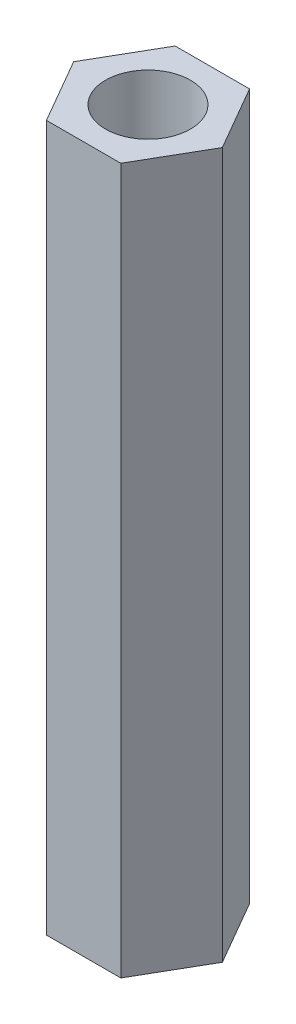
ISO-10303-21;
HEADER;
FILE_DESCRIPTION(('STEP AP214'),'2;1');
FILE_NAME('part.step','',(''),(''),'','','');
FILE_SCHEMA(('AUTOMOTIVE_DESIGN { 1 0 10303 214 1 1 1 1 }'));
ENDSEC;
DATA;
#1=APPLICATION_CONTEXT('core data for automotive mechanical design processes');
#2=APPLICATION_PROTOCOL_DEFINITION('international standard','automotive_design',2000,#1);
#3=PRODUCT_CONTEXT('',#1,'mechanical');
#4=PRODUCT('Part','Part','',(#3));
#5=PRODUCT_RELATED_PRODUCT_CATEGORY('part','',(#4));
#6=PRODUCT_DEFINITION_FORMATION('','',#4);
#7=PRODUCT_DEFINITION_CONTEXT('part definition',#1,'design');
#8=PRODUCT_DEFINITION('design','',#6,#7);
#9=PRODUCT_DEFINITION_SHAPE('','',#8);
#10=(LENGTH_UNIT() NAMED_UNIT(*) SI_UNIT(.MILLI.,.METRE.));
#11=(NAMED_UNIT(*) PLANE_ANGLE_UNIT() SI_UNIT($,.RADIAN.));
#12=(NAMED_UNIT(*) SI_UNIT($,.STERADIAN.) SOLID_ANGLE_UNIT());
#13=UNCERTAINTY_MEASURE_WITH_UNIT(LENGTH_MEASURE(1.E-05),#10,'distance_accuracy_value','');
#14=(GEOMETRIC_REPRESENTATION_CONTEXT(3) GLOBAL_UNCERTAINTY_ASSIGNED_CONTEXT((#13)) GLOBAL_UNIT_ASSIGNED_CONTEXT((#10,
#11,#12)) REPRESENTATION_CONTEXT('',''));
#15=CARTESIAN_POINT('',(0.,0.,0.));
#16=DIRECTION('',(0.,0.,1.));
#17=DIRECTION('',(1.,0.,0.));
#18=AXIS2_PLACEMENT_3D('',#15,#16,#17);
#19=CARTESIAN_POINT('',(0.,32.,0.));
#20=DIRECTION('',(0.,1.,0.));
#21=DIRECTION('',(0.,0.,1.));
#22=AXIS2_PLACEMENT_3D('',#19,#20,#21);
#23=PLANE('',#22);
#24=DIRECTION('',(-0.499999999999995,0.,0.866025403784442));
#25=VECTOR('',#24,1.);
#26=CARTESIAN_POINT('',(-1.68586278603374,32.,-2.91999999999998));
#27=LINE('',#26,#25);
#28=CARTESIAN_POINT('',(-1.68586278603374,32.,-2.91999999999998));
#29=VERTEX_POINT('',#28);
#30=CARTESIAN_POINT('',(-3.37172557206741,32.,0.));
#31=VERTEX_POINT('',#30);
#32=EDGE_CURVE('E130',#29,#31,#27,.T.);
#33=ORIENTED_EDGE('',*,*,#32,.T.);
#34=DIRECTION('',(0.500000000000001,0.,0.866025403784438));
#35=VECTOR('',#34,1.);
#36=CARTESIAN_POINT('',(-3.37172557206741,32.,0.));
#37=LINE('',#36,#35);
#38=CARTESIAN_POINT('',(-1.6858627860337,32.,2.92));
#39=VERTEX_POINT('',#38);
#40=EDGE_CURVE('E88',#31,#39,#37,.T.);
#41=ORIENTED_EDGE('',*,*,#40,.T.);
#42=DIRECTION('',(1.,0.,0.));
#43=VECTOR('',#42,1.);
#44=CARTESIAN_POINT('',(-1.6858627860337,32.,2.92));
#45=LINE('',#44,#43);
#46=CARTESIAN_POINT('',(1.68586278603372,32.,2.91999999999999));
#47=VERTEX_POINT('',#46);
#48=EDGE_CURVE('E101',#39,#47,#45,.T.);
#49=ORIENTED_EDGE('',*,*,#48,.T.);
#50=DIRECTION('',(0.499999999999995,0.,-0.866025403784441));
#51=VECTOR('',#50,1.);
#52=CARTESIAN_POINT('',(1.68586278603372,32.,2.91999999999999));
#53=LINE('',#52,#51);
#54=CARTESIAN_POINT('',(3.37172557206741,32.,0.));
#55=VERTEX_POINT('',#54);
#56=EDGE_CURVE('E95',#47,#55,#53,.T.);
#57=ORIENTED_EDGE('',*,*,#56,.T.);
#58=DIRECTION('',(-0.500000000000007,0.,-0.866025403784435));
#59=VECTOR('',#58,1.);
#60=CARTESIAN_POINT('',(3.37172557206741,32.,0.));
#61=LINE('',#60,#59);
#62=CARTESIAN_POINT('',(1.68586278603368,32.,-2.92000000000002));
#63=VERTEX_POINT('',#62);
#64=EDGE_CURVE('E99',#55,#63,#61,.T.);
#65=ORIENTED_EDGE('',*,*,#64,.T.);
#66=DIRECTION('',(-1.,0.,0.));
#67=VECTOR('',#66,1.);
#68=CARTESIAN_POINT('',(1.68586278603368,32.,-2.92000000000002));
#69=LINE('',#68,#67);
#70=EDGE_CURVE('E51',#63,#29,#69,.T.);
#71=ORIENTED_EDGE('',*,*,#70,.T.);
#72=EDGE_LOOP('',(#33,#41,#49,#57,#65,#71));
#73=FACE_BOUND('',#72,.T.);
#74=CARTESIAN_POINT('',(0.,32.,0.));
#75=DIRECTION('',(0.,1.,0.));
#76=DIRECTION('',(0.,0.,1.));
#77=AXIS2_PLACEMENT_3D('',#74,#75,#76);
#78=CIRCLE('',#77,1.925);
#79=CARTESIAN_POINT('',(0.,32.,1.925));
#80=VERTEX_POINT('',#79);
#81=EDGE_CURVE('E123',#80,#80,#78,.T.);
#82=ORIENTED_EDGE('',*,*,#81,.F.);
#83=EDGE_LOOP('',(#82));
#84=FACE_BOUND('',#83,.T.);
#85=ADVANCED_FACE('F34',(#73,#84),#23,.T.);
#86=CARTESIAN_POINT('',(0.,0.,0.));
#87=DIRECTION('',(0.,1.,0.));
#88=DIRECTION('',(0.,0.,1.));
#89=AXIS2_PLACEMENT_3D('',#86,#87,#88);
#90=PLANE('',#89);
#91=DIRECTION('',(-0.499999999999995,0.,0.866025403784442));
#92=VECTOR('',#91,1.);
#93=CARTESIAN_POINT('',(-1.68586278603374,0.,-2.91999999999998));
#94=LINE('',#93,#92);
#95=CARTESIAN_POINT('',(-1.68586278603374,0.,-2.91999999999998));
#96=VERTEX_POINT('',#95);
#97=CARTESIAN_POINT('',(-3.37172557206741,0.,0.));
#98=VERTEX_POINT('',#97);
#99=EDGE_CURVE('E119',#96,#98,#94,.T.);
#100=ORIENTED_EDGE('',*,*,#99,.F.);
#101=DIRECTION('',(-1.,0.,0.));
#102=VECTOR('',#101,1.);
#103=CARTESIAN_POINT('',(1.68586278603368,0.,-2.92000000000002));
#104=LINE('',#103,#102);
#105=CARTESIAN_POINT('',(1.68586278603368,0.,-2.92000000000002));
#106=VERTEX_POINT('',#105);
#107=EDGE_CURVE('E80',#106,#96,#104,.T.);
#108=ORIENTED_EDGE('',*,*,#107,.F.);
#109=DIRECTION('',(-0.500000000000007,0.,-0.866025403784435));
#110=VECTOR('',#109,1.);
#111=CARTESIAN_POINT('',(3.37172557206741,0.,0.));
#112=LINE('',#111,#110);
#113=CARTESIAN_POINT('',(3.37172557206741,0.,0.));
#114=VERTEX_POINT('',#113);
#115=EDGE_CURVE('E74',#114,#106,#112,.T.);
#116=ORIENTED_EDGE('',*,*,#115,.F.);
#117=DIRECTION('',(0.499999999999995,0.,-0.866025403784441));
#118=VECTOR('',#117,1.);
#119=CARTESIAN_POINT('',(1.68586278603372,0.,2.91999999999999));
#120=LINE('',#119,#118);
#121=CARTESIAN_POINT('',(1.68586278603372,0.,2.91999999999999));
#122=VERTEX_POINT('',#121);
#123=EDGE_CURVE('E109',#122,#114,#120,.T.);
#124=ORIENTED_EDGE('',*,*,#123,.F.);
#125=DIRECTION('',(1.,0.,0.));
#126=VECTOR('',#125,1.);
#127=CARTESIAN_POINT('',(-1.6858627860337,0.,2.92));
#128=LINE('',#127,#126);
#129=CARTESIAN_POINT('',(-1.6858627860337,0.,2.92));
#130=VERTEX_POINT('',#129);
#131=EDGE_CURVE('E125',#130,#122,#128,.T.);
#132=ORIENTED_EDGE('',*,*,#131,.F.);
#133=DIRECTION('',(0.500000000000001,0.,0.866025403784438));
#134=VECTOR('',#133,1.);
#135=CARTESIAN_POINT('',(-3.37172557206741,0.,0.));
#136=LINE('',#135,#134);
#137=EDGE_CURVE('E122',#98,#130,#136,.T.);
#138=ORIENTED_EDGE('',*,*,#137,.F.);
#139=EDGE_LOOP('',(#100,#108,#116,#124,#132,#138));
#140=FACE_BOUND('',#139,.T.);
#141=CARTESIAN_POINT('',(0.,0.,0.));
#142=DIRECTION('',(0.,1.,0.));
#143=DIRECTION('',(0.,0.,1.));
#144=AXIS2_PLACEMENT_3D('',#141,#142,#143);
#145=CIRCLE('',#144,1.925);
#146=CARTESIAN_POINT('',(0.,0.,1.925));
#147=VERTEX_POINT('',#146);
#148=EDGE_CURVE('E223',#147,#147,#145,.T.);
#149=ORIENTED_EDGE('',*,*,#148,.T.);
#150=EDGE_LOOP('',(#149));
#151=FACE_BOUND('',#150,.T.);
#152=ADVANCED_FACE('F139',(#140,#151),#90,.F.);
#153=CARTESIAN_POINT('',(-1.68586278603374,32.,-2.91999999999998));
#154=DIRECTION('',(0.866025403784442,0.,0.499999999999995));
#155=DIRECTION('',(0.499999999999995,0.,-0.866025403784442));
#156=AXIS2_PLACEMENT_3D('',#153,#154,#155);
#157=PLANE('',#156);
#158=ORIENTED_EDGE('',*,*,#99,.T.);
#159=DIRECTION('',(0.,-1.,0.));
#160=VECTOR('',#159,1.);
#161=CARTESIAN_POINT('',(-3.37172557206741,32.,0.));
#162=LINE('',#161,#160);
#163=EDGE_CURVE('E11',#31,#98,#162,.T.);
#164=ORIENTED_EDGE('',*,*,#163,.F.);
#165=ORIENTED_EDGE('',*,*,#32,.F.);
#166=DIRECTION('',(0.,-1.,0.));
#167=VECTOR('',#166,1.);
#168=CARTESIAN_POINT('',(-1.68586278603374,32.,-2.91999999999998));
#169=LINE('',#168,#167);
#170=EDGE_CURVE('E115',#29,#96,#169,.T.);
#171=ORIENTED_EDGE('',*,*,#170,.T.);
#172=EDGE_LOOP('',(#158,#164,#165,#171));
#173=FACE_BOUND('',#172,.T.);
#174=ADVANCED_FACE('F36',(#173),#157,.F.);
#175=CARTESIAN_POINT('',(-3.37172557206741,32.,0.));
#176=DIRECTION('',(0.866025403784438,0.,-0.500000000000001));
#177=DIRECTION('',(-0.500000000000001,0.,-0.866025403784438));
#178=AXIS2_PLACEMENT_3D('',#175,#176,#177);
#179=PLANE('',#178);
#180=ORIENTED_EDGE('',*,*,#137,.T.);
#181=DIRECTION('',(0.,-1.,0.));
#182=VECTOR('',#181,1.);
#183=CARTESIAN_POINT('',(-1.6858627860337,32.,2.92));
#184=LINE('',#183,#182);
#185=EDGE_CURVE('E43',#39,#130,#184,.T.);
#186=ORIENTED_EDGE('',*,*,#185,.F.);
#187=ORIENTED_EDGE('',*,*,#40,.F.);
#188=ORIENTED_EDGE('',*,*,#163,.T.);
#189=EDGE_LOOP('',(#180,#186,#187,#188));
#190=FACE_BOUND('',#189,.T.);
#191=ADVANCED_FACE('F164',(#190),#179,.F.);
#192=CARTESIAN_POINT('',(-1.6858627860337,32.,2.92));
#193=DIRECTION('',(0.,0.,-1.));
#194=DIRECTION('',(-1.,0.,0.));
#195=AXIS2_PLACEMENT_3D('',#192,#193,#194);
#196=PLANE('',#195);
#197=ORIENTED_EDGE('',*,*,#131,.T.);
#198=DIRECTION('',(0.,-1.,0.));
#199=VECTOR('',#198,1.);
#200=CARTESIAN_POINT('',(1.68586278603372,32.,2.91999999999999));
#201=LINE('',#200,#199);
#202=EDGE_CURVE('E110',#47,#122,#201,.T.);
#203=ORIENTED_EDGE('',*,*,#202,.F.);
#204=ORIENTED_EDGE('',*,*,#48,.F.);
#205=ORIENTED_EDGE('',*,*,#185,.T.);
#206=EDGE_LOOP('',(#197,#203,#204,#205));
#207=FACE_BOUND('',#206,.T.);
#208=ADVANCED_FACE('F136',(#207),#196,.F.);
#209=CARTESIAN_POINT('',(1.68586278603372,32.,2.91999999999999));
#210=DIRECTION('',(-0.866025403784441,0.,-0.499999999999995));
#211=DIRECTION('',(-0.499999999999995,0.,0.866025403784442));
#212=AXIS2_PLACEMENT_3D('',#209,#210,#211);
#213=PLANE('',#212);
#214=ORIENTED_EDGE('',*,*,#123,.T.);
#215=DIRECTION('',(0.,-1.,0.));
#216=VECTOR('',#215,1.);
#217=CARTESIAN_POINT('',(3.37172557206741,32.,0.));
#218=LINE('',#217,#216);
#219=EDGE_CURVE('E106',#55,#114,#218,.T.);
#220=ORIENTED_EDGE('',*,*,#219,.F.);
#221=ORIENTED_EDGE('',*,*,#56,.F.);
#222=ORIENTED_EDGE('',*,*,#202,.T.);
#223=EDGE_LOOP('',(#214,#220,#221,#222));
#224=FACE_BOUND('',#223,.T.);
#225=ADVANCED_FACE('F107',(#224),#213,.F.);
#226=CARTESIAN_POINT('',(3.37172557206741,32.,0.));
#227=DIRECTION('',(-0.866025403784435,0.,0.500000000000007));
#228=DIRECTION('',(0.500000000000007,0.,0.866025403784435));
#229=AXIS2_PLACEMENT_3D('',#226,#227,#228);
#230=PLANE('',#229);
#231=ORIENTED_EDGE('',*,*,#115,.T.);
#232=DIRECTION('',(0.,-1.,0.));
#233=VECTOR('',#232,1.);
#234=CARTESIAN_POINT('',(1.68586278603368,32.,-2.92000000000002));
#235=LINE('',#234,#233);
#236=EDGE_CURVE('E111',#63,#106,#235,.T.);
#237=ORIENTED_EDGE('',*,*,#236,.F.);
#238=ORIENTED_EDGE('',*,*,#64,.F.);
#239=ORIENTED_EDGE('',*,*,#219,.T.);
#240=EDGE_LOOP('',(#231,#237,#238,#239));
#241=FACE_BOUND('',#240,.T.);
#242=ADVANCED_FACE('F113',(#241),#230,.F.);
#243=CARTESIAN_POINT('',(1.68586278603368,32.,-2.92000000000002));
#244=DIRECTION('',(0.,0.,1.));
#245=DIRECTION('',(1.,0.,0.));
#246=AXIS2_PLACEMENT_3D('',#243,#244,#245);
#247=PLANE('',#246);
#248=ORIENTED_EDGE('',*,*,#107,.T.);
#249=ORIENTED_EDGE('',*,*,#170,.F.);
#250=ORIENTED_EDGE('',*,*,#70,.F.);
#251=ORIENTED_EDGE('',*,*,#236,.T.);
#252=EDGE_LOOP('',(#248,#249,#250,#251));
#253=FACE_BOUND('',#252,.T.);
#254=ADVANCED_FACE('F144',(#253),#247,.F.);
#255=CARTESIAN_POINT('',(0.,32.,0.));
#256=DIRECTION('',(0.,-1.,0.));
#257=DIRECTION('',(0.,0.,-1.));
#258=AXIS2_PLACEMENT_3D('',#255,#256,#257);
#259=CYLINDRICAL_SURFACE('',#258,1.925);
#260=ORIENTED_EDGE('',*,*,#81,.T.);
#261=EDGE_LOOP('',(#260));
#262=FACE_BOUND('',#261,.T.);
#263=ORIENTED_EDGE('',*,*,#148,.F.);
#264=EDGE_LOOP('',(#263));
#265=FACE_BOUND('',#264,.T.);
#266=ADVANCED_FACE('F146',(#262,#265),#259,.F.);
#267=CLOSED_SHELL('',(#85,#152,#174,#191,#208,#225,#242,#254,#266));
#268=MANIFOLD_SOLID_BREP('B2',#267);
#269=ADVANCED_BREP_SHAPE_REPRESENTATION('',(#18,#268),#14);
#270=SHAPE_DEFINITION_REPRESENTATION(#9,#269);
ENDSEC;
END-ISO-10303-21;
